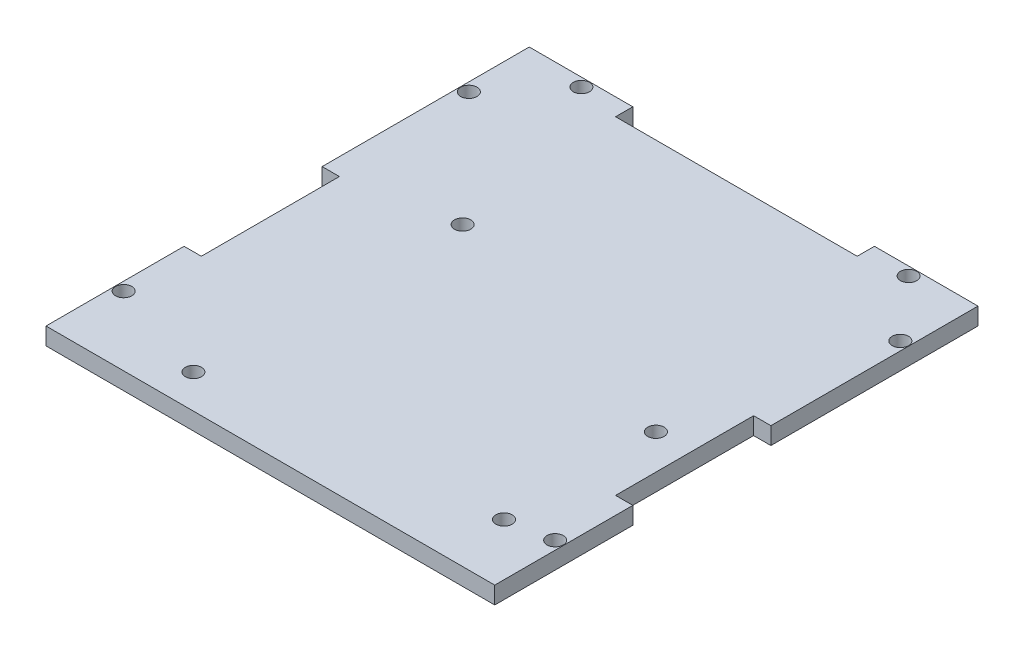
ISO-10303-21;
HEADER;
FILE_DESCRIPTION(('STEP AP214'),'2;1');
FILE_NAME('part.step','',(''),(''),'','','');
FILE_SCHEMA(('AUTOMOTIVE_DESIGN { 1 0 10303 214 1 1 1 1 }'));
ENDSEC;
DATA;
#1=APPLICATION_CONTEXT('core data for automotive mechanical design processes');
#2=APPLICATION_PROTOCOL_DEFINITION('international standard','automotive_design',2000,#1);
#3=PRODUCT_CONTEXT('',#1,'mechanical');
#4=PRODUCT('Part','Part','',(#3));
#5=PRODUCT_RELATED_PRODUCT_CATEGORY('part','',(#4));
#6=PRODUCT_DEFINITION_FORMATION('','',#4);
#7=PRODUCT_DEFINITION_CONTEXT('part definition',#1,'design');
#8=PRODUCT_DEFINITION('design','',#6,#7);
#9=PRODUCT_DEFINITION_SHAPE('','',#8);
#10=(LENGTH_UNIT() NAMED_UNIT(*) SI_UNIT(.MILLI.,.METRE.));
#11=(NAMED_UNIT(*) PLANE_ANGLE_UNIT() SI_UNIT($,.RADIAN.));
#12=(NAMED_UNIT(*) SI_UNIT($,.STERADIAN.) SOLID_ANGLE_UNIT());
#13=UNCERTAINTY_MEASURE_WITH_UNIT(LENGTH_MEASURE(1.E-05),#10,'distance_accuracy_value','');
#14=(GEOMETRIC_REPRESENTATION_CONTEXT(3) GLOBAL_UNCERTAINTY_ASSIGNED_CONTEXT((#13)) GLOBAL_UNIT_ASSIGNED_CONTEXT((#10,
#11,#12)) REPRESENTATION_CONTEXT('',''));
#15=CARTESIAN_POINT('',(0.,0.,0.));
#16=DIRECTION('',(0.,0.,1.));
#17=DIRECTION('',(1.,0.,0.));
#18=AXIS2_PLACEMENT_3D('',#15,#16,#17);
#19=CARTESIAN_POINT('',(41.275,3.175,-88.9000000000003));
#20=DIRECTION('',(0.,0.,1.));
#21=DIRECTION('',(1.,0.,0.));
#22=AXIS2_PLACEMENT_3D('',#19,#20,#21);
#23=PLANE('',#22);
#24=DIRECTION('',(-1.,0.,0.));
#25=VECTOR('',#24,1.);
#26=CARTESIAN_POINT('',(41.275,0.,-88.9000000000003));
#27=LINE('',#26,#25);
#28=CARTESIAN_POINT('',(41.275,0.,-88.9000000000003));
#29=VERTEX_POINT('',#28);
#30=CARTESIAN_POINT('',(22.225,0.,-88.9000000000002));
#31=VERTEX_POINT('',#30);
#32=EDGE_CURVE('E174',#29,#31,#27,.T.);
#33=ORIENTED_EDGE('',*,*,#32,.T.);
#34=DIRECTION('',(0.,-1.,0.));
#35=VECTOR('',#34,1.);
#36=CARTESIAN_POINT('',(22.225,3.175,-88.9000000000002));
#37=LINE('',#36,#35);
#38=CARTESIAN_POINT('',(22.225,3.175,-88.9000000000002));
#39=VERTEX_POINT('',#38);
#40=EDGE_CURVE('E11',#39,#31,#37,.T.);
#41=ORIENTED_EDGE('',*,*,#40,.F.);
#42=DIRECTION('',(-1.,0.,0.));
#43=VECTOR('',#42,1.);
#44=CARTESIAN_POINT('',(41.275,3.175,-88.9000000000003));
#45=LINE('',#44,#43);
#46=CARTESIAN_POINT('',(41.275,3.175,-88.9000000000003));
#47=VERTEX_POINT('',#46);
#48=EDGE_CURVE('E205',#47,#39,#45,.T.);
#49=ORIENTED_EDGE('',*,*,#48,.F.);
#50=DIRECTION('',(0.,-1.,0.));
#51=VECTOR('',#50,1.);
#52=CARTESIAN_POINT('',(41.275,3.175,-88.9000000000003));
#53=LINE('',#52,#51);
#54=EDGE_CURVE('E170',#47,#29,#53,.T.);
#55=ORIENTED_EDGE('',*,*,#54,.T.);
#56=EDGE_LOOP('',(#33,#41,#49,#55));
#57=FACE_BOUND('',#56,.T.);
#58=ADVANCED_FACE('F33',(#57),#23,.F.);
#59=CARTESIAN_POINT('',(22.225,3.175,-88.9000000000002));
#60=DIRECTION('',(1.,0.,0.));
#61=DIRECTION('',(0.,0.,-1.));
#62=AXIS2_PLACEMENT_3D('',#59,#60,#61);
#63=PLANE('',#62);
#64=DIRECTION('',(0.,0.,1.));
#65=VECTOR('',#64,1.);
#66=CARTESIAN_POINT('',(22.225,0.,-88.9000000000002));
#67=LINE('',#66,#65);
#68=CARTESIAN_POINT('',(22.225,0.,-85.7250000000002));
#69=VERTEX_POINT('',#68);
#70=EDGE_CURVE('E177',#31,#69,#67,.T.);
#71=ORIENTED_EDGE('',*,*,#70,.T.);
#72=DIRECTION('',(0.,-1.,0.));
#73=VECTOR('',#72,1.);
#74=CARTESIAN_POINT('',(22.225,3.175,-85.7250000000002));
#75=LINE('',#74,#73);
#76=CARTESIAN_POINT('',(22.225,3.175,-85.7250000000002));
#77=VERTEX_POINT('',#76);
#78=EDGE_CURVE('E41',#77,#69,#75,.T.);
#79=ORIENTED_EDGE('',*,*,#78,.F.);
#80=DIRECTION('',(0.,0.,1.));
#81=VECTOR('',#80,1.);
#82=CARTESIAN_POINT('',(22.225,3.175,-88.9000000000002));
#83=LINE('',#82,#81);
#84=EDGE_CURVE('E114',#39,#77,#83,.T.);
#85=ORIENTED_EDGE('',*,*,#84,.F.);
#86=ORIENTED_EDGE('',*,*,#40,.T.);
#87=EDGE_LOOP('',(#71,#79,#85,#86));
#88=FACE_BOUND('',#87,.T.);
#89=ADVANCED_FACE('F243',(#88),#63,.F.);
#90=CARTESIAN_POINT('',(-22.225,3.175,-85.7250000000002));
#91=DIRECTION('',(0.,0.,1.));
#92=DIRECTION('',(1.,0.,0.));
#93=AXIS2_PLACEMENT_3D('',#90,#91,#92);
#94=PLANE('',#93);
#95=DIRECTION('',(-1.,0.,0.));
#96=VECTOR('',#95,1.);
#97=CARTESIAN_POINT('',(-22.225,0.,-85.7250000000002));
#98=LINE('',#97,#96);
#99=CARTESIAN_POINT('',(-22.225,0.,-85.7250000000002));
#100=VERTEX_POINT('',#99);
#101=EDGE_CURVE('E181',#69,#100,#98,.T.);
#102=ORIENTED_EDGE('',*,*,#101,.T.);
#103=DIRECTION('',(0.,-1.,0.));
#104=VECTOR('',#103,1.);
#105=CARTESIAN_POINT('',(-22.225,3.175,-85.7250000000002));
#106=LINE('',#105,#104);
#107=CARTESIAN_POINT('',(-22.225,3.175,-85.7250000000002));
#108=VERTEX_POINT('',#107);
#109=EDGE_CURVE('E235',#108,#100,#106,.T.);
#110=ORIENTED_EDGE('',*,*,#109,.F.);
#111=DIRECTION('',(-1.,0.,0.));
#112=VECTOR('',#111,1.);
#113=CARTESIAN_POINT('',(10.2050575439094,3.175,-85.7250000000002));
#114=LINE('',#113,#112);
#115=EDGE_CURVE('E242',#77,#108,#114,.T.);
#116=ORIENTED_EDGE('',*,*,#115,.F.);
#117=ORIENTED_EDGE('',*,*,#78,.T.);
#118=EDGE_LOOP('',(#102,#110,#116,#117));
#119=FACE_BOUND('',#118,.T.);
#120=ADVANCED_FACE('F240',(#119),#94,.F.);
#121=CARTESIAN_POINT('',(-22.225,3.175,-88.9000000000002));
#122=DIRECTION('',(-1.,0.,0.));
#123=DIRECTION('',(0.,0.,1.));
#124=AXIS2_PLACEMENT_3D('',#121,#122,#123);
#125=PLANE('',#124);
#126=DIRECTION('',(0.,0.,-1.));
#127=VECTOR('',#126,1.);
#128=CARTESIAN_POINT('',(-22.225,0.,-88.9000000000002));
#129=LINE('',#128,#127);
#130=CARTESIAN_POINT('',(-22.225,0.,-88.9000000000002));
#131=VERTEX_POINT('',#130);
#132=EDGE_CURVE('E183',#100,#131,#129,.T.);
#133=ORIENTED_EDGE('',*,*,#132,.T.);
#134=DIRECTION('',(0.,-1.,0.));
#135=VECTOR('',#134,1.);
#136=CARTESIAN_POINT('',(-22.225,3.175,-88.9000000000002));
#137=LINE('',#136,#135);
#138=CARTESIAN_POINT('',(-22.225,3.175,-88.9000000000002));
#139=VERTEX_POINT('',#138);
#140=EDGE_CURVE('E232',#139,#131,#137,.T.);
#141=ORIENTED_EDGE('',*,*,#140,.F.);
#142=DIRECTION('',(0.,0.,-1.));
#143=VECTOR('',#142,1.);
#144=CARTESIAN_POINT('',(-22.225,3.175,-88.9000000000002));
#145=LINE('',#144,#143);
#146=EDGE_CURVE('E263',#108,#139,#145,.T.);
#147=ORIENTED_EDGE('',*,*,#146,.F.);
#148=ORIENTED_EDGE('',*,*,#109,.T.);
#149=EDGE_LOOP('',(#133,#141,#147,#148));
#150=FACE_BOUND('',#149,.T.);
#151=ADVANCED_FACE('F254',(#150),#125,.F.);
#152=CARTESIAN_POINT('',(-41.275,3.175,-88.9000000000003));
#153=DIRECTION('',(0.,0.,1.));
#154=DIRECTION('',(1.,0.,0.));
#155=AXIS2_PLACEMENT_3D('',#152,#153,#154);
#156=PLANE('',#155);
#157=DIRECTION('',(-1.,0.,0.));
#158=VECTOR('',#157,1.);
#159=CARTESIAN_POINT('',(-41.275,0.,-88.9000000000003));
#160=LINE('',#159,#158);
#161=CARTESIAN_POINT('',(-41.275,0.,-88.9000000000003));
#162=VERTEX_POINT('',#161);
#163=EDGE_CURVE('E185',#131,#162,#160,.T.);
#164=ORIENTED_EDGE('',*,*,#163,.T.);
#165=DIRECTION('',(0.,-1.,0.));
#166=VECTOR('',#165,1.);
#167=CARTESIAN_POINT('',(-41.275,3.175,-88.9000000000003));
#168=LINE('',#167,#166);
#169=CARTESIAN_POINT('',(-41.275,3.175,-88.9000000000003));
#170=VERTEX_POINT('',#169);
#171=EDGE_CURVE('E229',#170,#162,#168,.T.);
#172=ORIENTED_EDGE('',*,*,#171,.F.);
#173=DIRECTION('',(-1.,0.,0.));
#174=VECTOR('',#173,1.);
#175=CARTESIAN_POINT('',(-41.275,3.175,-88.9000000000003));
#176=LINE('',#175,#174);
#177=EDGE_CURVE('E260',#139,#170,#176,.T.);
#178=ORIENTED_EDGE('',*,*,#177,.F.);
#179=ORIENTED_EDGE('',*,*,#140,.T.);
#180=EDGE_LOOP('',(#164,#172,#178,#179));
#181=FACE_BOUND('',#180,.T.);
#182=ADVANCED_FACE('F258',(#181),#156,.F.);
#183=CARTESIAN_POINT('',(-41.275,3.175,-50.8000000000002));
#184=DIRECTION('',(1.,0.,0.));
#185=DIRECTION('',(0.,0.,-1.));
#186=AXIS2_PLACEMENT_3D('',#183,#184,#185);
#187=PLANE('',#186);
#188=DIRECTION('',(0.,0.,1.));
#189=VECTOR('',#188,1.);
#190=CARTESIAN_POINT('',(-41.275,0.,-50.8000000000002));
#191=LINE('',#190,#189);
#192=CARTESIAN_POINT('',(-41.275,0.,-50.8000000000002));
#193=VERTEX_POINT('',#192);
#194=EDGE_CURVE('E187',#162,#193,#191,.T.);
#195=ORIENTED_EDGE('',*,*,#194,.T.);
#196=DIRECTION('',(0.,-1.,0.));
#197=VECTOR('',#196,1.);
#198=CARTESIAN_POINT('',(-41.275,3.175,-50.8000000000002));
#199=LINE('',#198,#197);
#200=CARTESIAN_POINT('',(-41.275,3.175,-50.8000000000002));
#201=VERTEX_POINT('',#200);
#202=EDGE_CURVE('E226',#201,#193,#199,.T.);
#203=ORIENTED_EDGE('',*,*,#202,.F.);
#204=DIRECTION('',(0.,0.,1.));
#205=VECTOR('',#204,1.);
#206=CARTESIAN_POINT('',(-41.275,3.175,-50.8000000000002));
#207=LINE('',#206,#205);
#208=EDGE_CURVE('E262',#170,#201,#207,.T.);
#209=ORIENTED_EDGE('',*,*,#208,.F.);
#210=ORIENTED_EDGE('',*,*,#171,.T.);
#211=EDGE_LOOP('',(#195,#203,#209,#210));
#212=FACE_BOUND('',#211,.T.);
#213=ADVANCED_FACE('F320',(#212),#187,.F.);
#214=CARTESIAN_POINT('',(-41.275,3.175,-50.8000000000002));
#215=DIRECTION('',(0.,0.,-1.));
#216=DIRECTION('',(-1.,0.,0.));
#217=AXIS2_PLACEMENT_3D('',#214,#215,#216);
#218=PLANE('',#217);
#219=DIRECTION('',(1.,0.,0.));
#220=VECTOR('',#219,1.);
#221=CARTESIAN_POINT('',(-41.275,0.,-50.8000000000002));
#222=LINE('',#221,#220);
#223=CARTESIAN_POINT('',(-38.1,0.,-50.8000000000002));
#224=VERTEX_POINT('',#223);
#225=EDGE_CURVE('E189',#193,#224,#222,.T.);
#226=ORIENTED_EDGE('',*,*,#225,.T.);
#227=DIRECTION('',(0.,-1.,0.));
#228=VECTOR('',#227,1.);
#229=CARTESIAN_POINT('',(-38.1,3.175,-50.8000000000002));
#230=LINE('',#229,#228);
#231=CARTESIAN_POINT('',(-38.1,3.175,-50.8000000000002));
#232=VERTEX_POINT('',#231);
#233=EDGE_CURVE('E223',#232,#224,#230,.T.);
#234=ORIENTED_EDGE('',*,*,#233,.F.);
#235=DIRECTION('',(1.,0.,0.));
#236=VECTOR('',#235,1.);
#237=CARTESIAN_POINT('',(-41.275,3.175,-50.8000000000002));
#238=LINE('',#237,#236);
#239=EDGE_CURVE('E265',#201,#232,#238,.T.);
#240=ORIENTED_EDGE('',*,*,#239,.F.);
#241=ORIENTED_EDGE('',*,*,#202,.T.);
#242=EDGE_LOOP('',(#226,#234,#240,#241));
#243=FACE_BOUND('',#242,.T.);
#244=ADVANCED_FACE('F317',(#243),#218,.F.);
#245=CARTESIAN_POINT('',(-38.1,3.175,-50.8000000000002));
#246=DIRECTION('',(1.,0.,0.));
#247=DIRECTION('',(0.,0.,-1.));
#248=AXIS2_PLACEMENT_3D('',#245,#246,#247);
#249=PLANE('',#248);
#250=DIRECTION('',(0.,0.,1.));
#251=VECTOR('',#250,1.);
#252=CARTESIAN_POINT('',(-38.1,0.,-50.8000000000002));
#253=LINE('',#252,#251);
#254=CARTESIAN_POINT('',(-38.1,0.,-25.4000000000002));
#255=VERTEX_POINT('',#254);
#256=EDGE_CURVE('E191',#224,#255,#253,.T.);
#257=ORIENTED_EDGE('',*,*,#256,.T.);
#258=DIRECTION('',(0.,-1.,0.));
#259=VECTOR('',#258,1.);
#260=CARTESIAN_POINT('',(-38.1,3.175,-25.4000000000002));
#261=LINE('',#260,#259);
#262=CARTESIAN_POINT('',(-38.1,3.175,-25.4000000000002));
#263=VERTEX_POINT('',#262);
#264=EDGE_CURVE('E220',#263,#255,#261,.T.);
#265=ORIENTED_EDGE('',*,*,#264,.F.);
#266=DIRECTION('',(0.,0.,1.));
#267=VECTOR('',#266,1.);
#268=CARTESIAN_POINT('',(-38.1,3.175,-50.8000000000002));
#269=LINE('',#268,#267);
#270=EDGE_CURVE('E271',#232,#263,#269,.T.);
#271=ORIENTED_EDGE('',*,*,#270,.F.);
#272=ORIENTED_EDGE('',*,*,#233,.T.);
#273=EDGE_LOOP('',(#257,#265,#271,#272));
#274=FACE_BOUND('',#273,.T.);
#275=ADVANCED_FACE('F313',(#274),#249,.F.);
#276=CARTESIAN_POINT('',(-38.1,3.175,-25.4000000000002));
#277=DIRECTION('',(0.,0.,1.));
#278=DIRECTION('',(1.,0.,0.));
#279=AXIS2_PLACEMENT_3D('',#276,#277,#278);
#280=PLANE('',#279);
#281=DIRECTION('',(-1.,0.,0.));
#282=VECTOR('',#281,1.);
#283=CARTESIAN_POINT('',(-38.1,0.,-25.4000000000002));
#284=LINE('',#283,#282);
#285=CARTESIAN_POINT('',(-41.275,0.,-25.4000000000002));
#286=VERTEX_POINT('',#285);
#287=EDGE_CURVE('E193',#255,#286,#284,.T.);
#288=ORIENTED_EDGE('',*,*,#287,.T.);
#289=DIRECTION('',(0.,-1.,0.));
#290=VECTOR('',#289,1.);
#291=CARTESIAN_POINT('',(-41.275,3.175,-25.4000000000002));
#292=LINE('',#291,#290);
#293=CARTESIAN_POINT('',(-41.275,3.175,-25.4000000000002));
#294=VERTEX_POINT('',#293);
#295=EDGE_CURVE('E217',#294,#286,#292,.T.);
#296=ORIENTED_EDGE('',*,*,#295,.F.);
#297=DIRECTION('',(-1.,0.,0.));
#298=VECTOR('',#297,1.);
#299=CARTESIAN_POINT('',(-38.1,3.175,-25.4000000000002));
#300=LINE('',#299,#298);
#301=EDGE_CURVE('E273',#263,#294,#300,.T.);
#302=ORIENTED_EDGE('',*,*,#301,.F.);
#303=ORIENTED_EDGE('',*,*,#264,.T.);
#304=EDGE_LOOP('',(#288,#296,#302,#303));
#305=FACE_BOUND('',#304,.T.);
#306=ADVANCED_FACE('F309',(#305),#280,.F.);
#307=CARTESIAN_POINT('',(-41.275,3.175,0.));
#308=DIRECTION('',(1.,0.,0.));
#309=DIRECTION('',(0.,0.,-1.));
#310=AXIS2_PLACEMENT_3D('',#307,#308,#309);
#311=PLANE('',#310);
#312=DIRECTION('',(0.,0.,1.));
#313=VECTOR('',#312,1.);
#314=CARTESIAN_POINT('',(-41.275,0.,0.));
#315=LINE('',#314,#313);
#316=CARTESIAN_POINT('',(-41.275,0.,0.));
#317=VERTEX_POINT('',#316);
#318=EDGE_CURVE('E195',#286,#317,#315,.T.);
#319=ORIENTED_EDGE('',*,*,#318,.T.);
#320=DIRECTION('',(0.,-1.,0.));
#321=VECTOR('',#320,1.);
#322=CARTESIAN_POINT('',(-41.275,3.175,0.));
#323=LINE('',#322,#321);
#324=CARTESIAN_POINT('',(-41.275,3.175,0.));
#325=VERTEX_POINT('',#324);
#326=EDGE_CURVE('E215',#325,#317,#323,.T.);
#327=ORIENTED_EDGE('',*,*,#326,.F.);
#328=DIRECTION('',(0.,0.,1.));
#329=VECTOR('',#328,1.);
#330=CARTESIAN_POINT('',(-41.275,3.175,0.));
#331=LINE('',#330,#329);
#332=EDGE_CURVE('E275',#294,#325,#331,.T.);
#333=ORIENTED_EDGE('',*,*,#332,.F.);
#334=ORIENTED_EDGE('',*,*,#295,.T.);
#335=EDGE_LOOP('',(#319,#327,#333,#334));
#336=FACE_BOUND('',#335,.T.);
#337=ADVANCED_FACE('F304',(#336),#311,.F.);
#338=CARTESIAN_POINT('',(41.275,3.175,0.));
#339=DIRECTION('',(-1.,0.,0.));
#340=DIRECTION('',(0.,0.,1.));
#341=AXIS2_PLACEMENT_3D('',#338,#339,#340);
#342=PLANE('',#341);
#343=DIRECTION('',(0.,0.,-1.));
#344=VECTOR('',#343,1.);
#345=CARTESIAN_POINT('',(41.275,0.,0.));
#346=LINE('',#345,#344);
#347=CARTESIAN_POINT('',(41.275,0.,0.));
#348=VERTEX_POINT('',#347);
#349=CARTESIAN_POINT('',(41.275,0.,-25.4000000000002));
#350=VERTEX_POINT('',#349);
#351=EDGE_CURVE('E198',#348,#350,#346,.T.);
#352=ORIENTED_EDGE('',*,*,#351,.T.);
#353=DIRECTION('',(0.,-1.,0.));
#354=VECTOR('',#353,1.);
#355=CARTESIAN_POINT('',(41.275,3.175,-25.4000000000002));
#356=LINE('',#355,#354);
#357=CARTESIAN_POINT('',(41.275,3.175,-25.4000000000002));
#358=VERTEX_POINT('',#357);
#359=EDGE_CURVE('E209',#358,#350,#356,.T.);
#360=ORIENTED_EDGE('',*,*,#359,.F.);
#361=DIRECTION('',(0.,0.,-1.));
#362=VECTOR('',#361,1.);
#363=CARTESIAN_POINT('',(41.275,3.175,0.));
#364=LINE('',#363,#362);
#365=CARTESIAN_POINT('',(41.275,3.175,0.));
#366=VERTEX_POINT('',#365);
#367=EDGE_CURVE('E278',#366,#358,#364,.T.);
#368=ORIENTED_EDGE('',*,*,#367,.F.);
#369=DIRECTION('',(0.,-1.,0.));
#370=VECTOR('',#369,1.);
#371=CARTESIAN_POINT('',(41.275,3.175,0.));
#372=LINE('',#371,#370);
#373=EDGE_CURVE('E212',#366,#348,#372,.T.);
#374=ORIENTED_EDGE('',*,*,#373,.T.);
#375=EDGE_LOOP('',(#352,#360,#368,#374));
#376=FACE_BOUND('',#375,.T.);
#377=ADVANCED_FACE('F285',(#376),#342,.F.);
#378=CARTESIAN_POINT('',(38.1,3.175,-25.4000000000002));
#379=DIRECTION('',(0.,0.,1.));
#380=DIRECTION('',(1.,0.,0.));
#381=AXIS2_PLACEMENT_3D('',#378,#379,#380);
#382=PLANE('',#381);
#383=DIRECTION('',(-1.,0.,0.));
#384=VECTOR('',#383,1.);
#385=CARTESIAN_POINT('',(38.1,0.,-25.4000000000002));
#386=LINE('',#385,#384);
#387=CARTESIAN_POINT('',(38.1,0.,-25.4000000000002));
#388=VERTEX_POINT('',#387);
#389=EDGE_CURVE('E200',#350,#388,#386,.T.);
#390=ORIENTED_EDGE('',*,*,#389,.T.);
#391=DIRECTION('',(0.,-1.,0.));
#392=VECTOR('',#391,1.);
#393=CARTESIAN_POINT('',(38.1,3.175,-25.4000000000002));
#394=LINE('',#393,#392);
#395=CARTESIAN_POINT('',(38.1,3.175,-25.4000000000002));
#396=VERTEX_POINT('',#395);
#397=EDGE_CURVE('E165',#396,#388,#394,.T.);
#398=ORIENTED_EDGE('',*,*,#397,.F.);
#399=DIRECTION('',(-1.,0.,0.));
#400=VECTOR('',#399,1.);
#401=CARTESIAN_POINT('',(38.1,3.175,-25.4000000000002));
#402=LINE('',#401,#400);
#403=EDGE_CURVE('E156',#358,#396,#402,.T.);
#404=ORIENTED_EDGE('',*,*,#403,.F.);
#405=ORIENTED_EDGE('',*,*,#359,.T.);
#406=EDGE_LOOP('',(#390,#398,#404,#405));
#407=FACE_BOUND('',#406,.T.);
#408=ADVANCED_FACE('F288',(#407),#382,.F.);
#409=CARTESIAN_POINT('',(38.1,3.175,-50.8000000000002));
#410=DIRECTION('',(-1.,0.,0.));
#411=DIRECTION('',(0.,0.,1.));
#412=AXIS2_PLACEMENT_3D('',#409,#410,#411);
#413=PLANE('',#412);
#414=DIRECTION('',(0.,0.,-1.));
#415=VECTOR('',#414,1.);
#416=CARTESIAN_POINT('',(38.1,0.,-50.8000000000002));
#417=LINE('',#416,#415);
#418=CARTESIAN_POINT('',(38.1,0.,-50.8000000000002));
#419=VERTEX_POINT('',#418);
#420=EDGE_CURVE('E164',#388,#419,#417,.T.);
#421=ORIENTED_EDGE('',*,*,#420,.T.);
#422=DIRECTION('',(0.,-1.,0.));
#423=VECTOR('',#422,1.);
#424=CARTESIAN_POINT('',(38.1,3.175,-50.8000000000002));
#425=LINE('',#424,#423);
#426=CARTESIAN_POINT('',(38.1,3.175,-50.8000000000002));
#427=VERTEX_POINT('',#426);
#428=EDGE_CURVE('E161',#427,#419,#425,.T.);
#429=ORIENTED_EDGE('',*,*,#428,.F.);
#430=DIRECTION('',(0.,0.,-1.));
#431=VECTOR('',#430,1.);
#432=CARTESIAN_POINT('',(38.1,3.175,-50.8000000000002));
#433=LINE('',#432,#431);
#434=EDGE_CURVE('E148',#396,#427,#433,.T.);
#435=ORIENTED_EDGE('',*,*,#434,.F.);
#436=ORIENTED_EDGE('',*,*,#397,.T.);
#437=EDGE_LOOP('',(#421,#429,#435,#436));
#438=FACE_BOUND('',#437,.T.);
#439=ADVANCED_FACE('F162',(#438),#413,.F.);
#440=CARTESIAN_POINT('',(41.275,3.175,-50.8000000000002));
#441=DIRECTION('',(0.,0.,-1.));
#442=DIRECTION('',(-1.,0.,0.));
#443=AXIS2_PLACEMENT_3D('',#440,#441,#442);
#444=PLANE('',#443);
#445=DIRECTION('',(1.,0.,0.));
#446=VECTOR('',#445,1.);
#447=CARTESIAN_POINT('',(41.275,0.,-50.8000000000002));
#448=LINE('',#447,#446);
#449=CARTESIAN_POINT('',(41.275,0.,-50.8000000000002));
#450=VERTEX_POINT('',#449);
#451=EDGE_CURVE('E100',#419,#450,#448,.T.);
#452=ORIENTED_EDGE('',*,*,#451,.T.);
#453=DIRECTION('',(0.,-1.,0.));
#454=VECTOR('',#453,1.);
#455=CARTESIAN_POINT('',(41.275,3.175,-50.8000000000002));
#456=LINE('',#455,#454);
#457=CARTESIAN_POINT('',(41.275,3.175,-50.8000000000002));
#458=VERTEX_POINT('',#457);
#459=EDGE_CURVE('E166',#458,#450,#456,.T.);
#460=ORIENTED_EDGE('',*,*,#459,.F.);
#461=DIRECTION('',(1.,0.,0.));
#462=VECTOR('',#461,1.);
#463=CARTESIAN_POINT('',(41.275,3.175,-50.8000000000002));
#464=LINE('',#463,#462);
#465=EDGE_CURVE('E154',#427,#458,#464,.T.);
#466=ORIENTED_EDGE('',*,*,#465,.F.);
#467=ORIENTED_EDGE('',*,*,#428,.T.);
#468=EDGE_LOOP('',(#452,#460,#466,#467));
#469=FACE_BOUND('',#468,.T.);
#470=ADVANCED_FACE('F168',(#469),#444,.F.);
#471=CARTESIAN_POINT('',(41.275,3.175,-50.8000000000002));
#472=DIRECTION('',(-1.,0.,0.));
#473=DIRECTION('',(0.,0.,1.));
#474=AXIS2_PLACEMENT_3D('',#471,#472,#473);
#475=PLANE('',#474);
#476=DIRECTION('',(0.,0.,-1.));
#477=VECTOR('',#476,1.);
#478=CARTESIAN_POINT('',(41.275,0.,-50.8000000000002));
#479=LINE('',#478,#477);
#480=EDGE_CURVE('E106',#450,#29,#479,.T.);
#481=ORIENTED_EDGE('',*,*,#480,.T.);
#482=ORIENTED_EDGE('',*,*,#54,.F.);
#483=DIRECTION('',(0.,0.,-1.));
#484=VECTOR('',#483,1.);
#485=CARTESIAN_POINT('',(41.275,3.175,-50.8000000000002));
#486=LINE('',#485,#484);
#487=EDGE_CURVE('E49',#458,#47,#486,.T.);
#488=ORIENTED_EDGE('',*,*,#487,.F.);
#489=ORIENTED_EDGE('',*,*,#459,.T.);
#490=EDGE_LOOP('',(#481,#482,#488,#489));
#491=FACE_BOUND('',#490,.T.);
#492=ADVANCED_FACE('F335',(#491),#475,.F.);
#493=CARTESIAN_POINT('',(0.,3.175,0.));
#494=DIRECTION('',(0.,1.,0.));
#495=DIRECTION('',(0.,0.,1.));
#496=AXIS2_PLACEMENT_3D('',#493,#494,#495);
#497=PLANE('',#496);
#498=CARTESIAN_POINT('',(30.099,3.175,-87.3125000000002));
#499=DIRECTION('',(0.,1.,0.));
#500=DIRECTION('',(0.,0.,1.));
#501=AXIS2_PLACEMENT_3D('',#498,#499,#500);
#502=CIRCLE('',#501,1.5);
#503=CARTESIAN_POINT('',(30.099,3.175,-85.8125000000002));
#504=VERTEX_POINT('',#503);
#505=EDGE_CURVE('E513',#504,#504,#502,.T.);
#506=ORIENTED_EDGE('',*,*,#505,.F.);
#507=EDGE_LOOP('',(#506));
#508=FACE_BOUND('',#507,.T.);
#509=CARTESIAN_POINT('',(-30.099,3.175,-87.3125000000002));
#510=DIRECTION('',(0.,1.,0.));
#511=DIRECTION('',(0.,0.,1.));
#512=AXIS2_PLACEMENT_3D('',#509,#510,#511);
#513=CIRCLE('',#512,1.5);
#514=CARTESIAN_POINT('',(-30.099,3.175,-85.8125000000002));
#515=VERTEX_POINT('',#514);
#516=EDGE_CURVE('E515',#515,#515,#513,.T.);
#517=ORIENTED_EDGE('',*,*,#516,.F.);
#518=EDGE_LOOP('',(#517));
#519=FACE_BOUND('',#518,.T.);
#520=DIRECTION('',(-1.,0.,0.));
#521=VECTOR('',#520,1.);
#522=CARTESIAN_POINT('',(41.275,3.175,0.));
#523=LINE('',#522,#521);
#524=EDGE_CURVE('E283',#366,#325,#523,.T.);
#525=ORIENTED_EDGE('',*,*,#524,.F.);
#526=ORIENTED_EDGE('',*,*,#367,.T.);
#527=ORIENTED_EDGE('',*,*,#403,.T.);
#528=ORIENTED_EDGE('',*,*,#434,.T.);
#529=ORIENTED_EDGE('',*,*,#465,.T.);
#530=ORIENTED_EDGE('',*,*,#487,.T.);
#531=ORIENTED_EDGE('',*,*,#48,.T.);
#532=ORIENTED_EDGE('',*,*,#84,.T.);
#533=ORIENTED_EDGE('',*,*,#115,.T.);
#534=ORIENTED_EDGE('',*,*,#146,.T.);
#535=ORIENTED_EDGE('',*,*,#177,.T.);
#536=ORIENTED_EDGE('',*,*,#208,.T.);
#537=ORIENTED_EDGE('',*,*,#239,.T.);
#538=ORIENTED_EDGE('',*,*,#270,.T.);
#539=ORIENTED_EDGE('',*,*,#301,.T.);
#540=ORIENTED_EDGE('',*,*,#332,.T.);
#541=EDGE_LOOP('',(#525,#526,#527,#528,#529,#530,#531,#532,#533,#534,#535,#536,#537,#538,#539,#540));
#542=FACE_BOUND('',#541,.T.);
#543=CARTESIAN_POINT('',(-19.1185113449206,3.175,-54.4850000000003));
#544=DIRECTION('',(0.,1.,0.));
#545=DIRECTION('',(0.,0.,1.));
#546=AXIS2_PLACEMENT_3D('',#543,#544,#545);
#547=CIRCLE('',#546,1.5);
#548=CARTESIAN_POINT('',(-19.1185113449206,3.175,-52.9850000000003));
#549=VERTEX_POINT('',#548);
#550=EDGE_CURVE('E522',#549,#549,#547,.T.);
#551=ORIENTED_EDGE('',*,*,#550,.F.);
#552=EDGE_LOOP('',(#551));
#553=FACE_BOUND('',#552,.T.);
#554=CARTESIAN_POINT('',(-20.3885113449206,3.175,-6.22500000000029));
#555=DIRECTION('',(0.,1.,0.));
#556=DIRECTION('',(0.,0.,1.));
#557=AXIS2_PLACEMENT_3D('',#554,#555,#556);
#558=CIRCLE('',#557,1.5);
#559=CARTESIAN_POINT('',(-20.3885113449206,3.175,-4.72500000000029));
#560=VERTEX_POINT('',#559);
#561=EDGE_CURVE('E527',#560,#560,#558,.T.);
#562=ORIENTED_EDGE('',*,*,#561,.F.);
#563=EDGE_LOOP('',(#562));
#564=FACE_BOUND('',#563,.T.);
#565=CARTESIAN_POINT('',(31.6814886550794,3.175,-39.2450000000003));
#566=DIRECTION('',(0.,1.,0.));
#567=DIRECTION('',(0.,0.,1.));
#568=AXIS2_PLACEMENT_3D('',#565,#566,#567);
#569=CIRCLE('',#568,1.5);
#570=CARTESIAN_POINT('',(31.6814886550794,3.175,-37.7450000000003));
#571=VERTEX_POINT('',#570);
#572=EDGE_CURVE('E533',#571,#571,#569,.T.);
#573=ORIENTED_EDGE('',*,*,#572,.F.);
#574=EDGE_LOOP('',(#573));
#575=FACE_BOUND('',#574,.T.);
#576=CARTESIAN_POINT('',(31.6814886550794,3.175,-11.3050000000003));
#577=DIRECTION('',(0.,1.,0.));
#578=DIRECTION('',(0.,0.,1.));
#579=AXIS2_PLACEMENT_3D('',#576,#577,#578);
#580=CIRCLE('',#579,1.5);
#581=CARTESIAN_POINT('',(31.6814886550794,3.175,-9.80500000000028));
#582=VERTEX_POINT('',#581);
#583=EDGE_CURVE('E539',#582,#582,#580,.T.);
#584=ORIENTED_EDGE('',*,*,#583,.F.);
#585=EDGE_LOOP('',(#584));
#586=FACE_BOUND('',#585,.T.);
#587=CARTESIAN_POINT('',(39.6875,3.175,-76.2000000000003));
#588=DIRECTION('',(0.,-1.,0.));
#589=DIRECTION('',(0.,0.,1.));
#590=AXIS2_PLACEMENT_3D('',#587,#588,#589);
#591=CIRCLE('',#590,1.5);
#592=CARTESIAN_POINT('',(39.6875,3.175,-74.7000000000003));
#593=VERTEX_POINT('',#592);
#594=EDGE_CURVE('E548',#593,#593,#591,.T.);
#595=ORIENTED_EDGE('',*,*,#594,.T.);
#596=EDGE_LOOP('',(#595));
#597=FACE_BOUND('',#596,.T.);
#598=CARTESIAN_POINT('',(39.6875,3.175,-12.7000000000002));
#599=DIRECTION('',(0.,-1.,0.));
#600=DIRECTION('',(0.,0.,1.));
#601=AXIS2_PLACEMENT_3D('',#598,#599,#600);
#602=CIRCLE('',#601,1.500000048);
#603=CARTESIAN_POINT('',(39.6875,3.175,-11.1999999520002));
#604=VERTEX_POINT('',#603);
#605=EDGE_CURVE('E554',#604,#604,#602,.T.);
#606=ORIENTED_EDGE('',*,*,#605,.T.);
#607=EDGE_LOOP('',(#606));
#608=FACE_BOUND('',#607,.T.);
#609=CARTESIAN_POINT('',(-39.6875,3.175,-12.7000000000002));
#610=DIRECTION('',(0.,-1.,0.));
#611=DIRECTION('',(0.,0.,-1.));
#612=AXIS2_PLACEMENT_3D('',#609,#610,#611);
#613=CIRCLE('',#612,1.500000048);
#614=CARTESIAN_POINT('',(-39.6875,3.175,-14.2000000480002));
#615=VERTEX_POINT('',#614);
#616=EDGE_CURVE('E560',#615,#615,#613,.T.);
#617=ORIENTED_EDGE('',*,*,#616,.T.);
#618=EDGE_LOOP('',(#617));
#619=FACE_BOUND('',#618,.T.);
#620=CARTESIAN_POINT('',(-39.6875,3.175,-76.2000000000003));
#621=DIRECTION('',(0.,-1.,0.));
#622=DIRECTION('',(0.,0.,-1.));
#623=AXIS2_PLACEMENT_3D('',#620,#621,#622);
#624=CIRCLE('',#623,1.5);
#625=CARTESIAN_POINT('',(-39.6875,3.175,-77.7000000000003));
#626=VERTEX_POINT('',#625);
#627=EDGE_CURVE('E178',#626,#626,#624,.T.);
#628=ORIENTED_EDGE('',*,*,#627,.T.);
#629=EDGE_LOOP('',(#628));
#630=FACE_BOUND('',#629,.T.);
#631=ADVANCED_FACE('F151',(#508,#519,#542,#553,#564,#575,#586,#597,#608,#619,#630),#497,.T.);
#632=CARTESIAN_POINT('',(0.,0.,0.));
#633=DIRECTION('',(0.,1.,0.));
#634=DIRECTION('',(0.,0.,1.));
#635=AXIS2_PLACEMENT_3D('',#632,#633,#634);
#636=PLANE('',#635);
#637=CARTESIAN_POINT('',(30.099,0.,-87.3125000000002));
#638=DIRECTION('',(0.,1.,0.));
#639=DIRECTION('',(0.,0.,1.));
#640=AXIS2_PLACEMENT_3D('',#637,#638,#639);
#641=CIRCLE('',#640,1.5);
#642=CARTESIAN_POINT('',(30.099,0.,-85.8125000000002));
#643=VERTEX_POINT('',#642);
#644=EDGE_CURVE('E510',#643,#643,#641,.T.);
#645=ORIENTED_EDGE('',*,*,#644,.T.);
#646=EDGE_LOOP('',(#645));
#647=FACE_BOUND('',#646,.T.);
#648=CARTESIAN_POINT('',(-30.099,0.,-87.3125000000002));
#649=DIRECTION('',(0.,1.,0.));
#650=DIRECTION('',(0.,0.,1.));
#651=AXIS2_PLACEMENT_3D('',#648,#649,#650);
#652=CIRCLE('',#651,1.5);
#653=CARTESIAN_POINT('',(-30.099,0.,-85.8125000000002));
#654=VERTEX_POINT('',#653);
#655=EDGE_CURVE('E298',#654,#654,#652,.T.);
#656=ORIENTED_EDGE('',*,*,#655,.T.);
#657=EDGE_LOOP('',(#656));
#658=FACE_BOUND('',#657,.T.);
#659=CARTESIAN_POINT('',(-19.1185113449206,0.,-54.4850000000003));
#660=DIRECTION('',(0.,1.,0.));
#661=DIRECTION('',(0.,0.,1.));
#662=AXIS2_PLACEMENT_3D('',#659,#660,#661);
#663=CIRCLE('',#662,1.5);
#664=CARTESIAN_POINT('',(-19.1185113449206,0.,-52.9850000000003));
#665=VERTEX_POINT('',#664);
#666=EDGE_CURVE('E524',#665,#665,#663,.T.);
#667=ORIENTED_EDGE('',*,*,#666,.T.);
#668=EDGE_LOOP('',(#667));
#669=FACE_BOUND('',#668,.T.);
#670=CARTESIAN_POINT('',(-20.3885113449206,0.,-6.22500000000029));
#671=DIRECTION('',(0.,1.,0.));
#672=DIRECTION('',(0.,0.,1.));
#673=AXIS2_PLACEMENT_3D('',#670,#671,#672);
#674=CIRCLE('',#673,1.5);
#675=CARTESIAN_POINT('',(-20.3885113449206,0.,-4.72500000000029));
#676=VERTEX_POINT('',#675);
#677=EDGE_CURVE('E530',#676,#676,#674,.T.);
#678=ORIENTED_EDGE('',*,*,#677,.T.);
#679=EDGE_LOOP('',(#678));
#680=FACE_BOUND('',#679,.T.);
#681=CARTESIAN_POINT('',(31.6814886550794,0.,-39.2450000000003));
#682=DIRECTION('',(0.,1.,0.));
#683=DIRECTION('',(0.,0.,1.));
#684=AXIS2_PLACEMENT_3D('',#681,#682,#683);
#685=CIRCLE('',#684,1.5);
#686=CARTESIAN_POINT('',(31.6814886550794,0.,-37.7450000000003));
#687=VERTEX_POINT('',#686);
#688=EDGE_CURVE('E536',#687,#687,#685,.T.);
#689=ORIENTED_EDGE('',*,*,#688,.T.);
#690=EDGE_LOOP('',(#689));
#691=FACE_BOUND('',#690,.T.);
#692=CARTESIAN_POINT('',(31.6814886550794,0.,-11.3050000000003));
#693=DIRECTION('',(0.,1.,0.));
#694=DIRECTION('',(0.,0.,1.));
#695=AXIS2_PLACEMENT_3D('',#692,#693,#694);
#696=CIRCLE('',#695,1.5);
#697=CARTESIAN_POINT('',(31.6814886550794,0.,-9.80500000000028));
#698=VERTEX_POINT('',#697);
#699=EDGE_CURVE('E542',#698,#698,#696,.T.);
#700=ORIENTED_EDGE('',*,*,#699,.T.);
#701=EDGE_LOOP('',(#700));
#702=FACE_BOUND('',#701,.T.);
#703=CARTESIAN_POINT('',(39.6875,0.,-76.2000000000003));
#704=DIRECTION('',(0.,-1.,0.));
#705=DIRECTION('',(0.,0.,1.));
#706=AXIS2_PLACEMENT_3D('',#703,#704,#705);
#707=CIRCLE('',#706,1.5);
#708=CARTESIAN_POINT('',(39.6875,0.,-74.7000000000003));
#709=VERTEX_POINT('',#708);
#710=EDGE_CURVE('E545',#709,#709,#707,.T.);
#711=ORIENTED_EDGE('',*,*,#710,.F.);
#712=EDGE_LOOP('',(#711));
#713=FACE_BOUND('',#712,.T.);
#714=CARTESIAN_POINT('',(39.6875,0.,-12.7000000000002));
#715=DIRECTION('',(0.,-1.,0.));
#716=DIRECTION('',(0.,0.,1.));
#717=AXIS2_PLACEMENT_3D('',#714,#715,#716);
#718=CIRCLE('',#717,1.500000048);
#719=CARTESIAN_POINT('',(39.6875,0.,-11.1999999520002));
#720=VERTEX_POINT('',#719);
#721=EDGE_CURVE('E551',#720,#720,#718,.T.);
#722=ORIENTED_EDGE('',*,*,#721,.F.);
#723=EDGE_LOOP('',(#722));
#724=FACE_BOUND('',#723,.T.);
#725=CARTESIAN_POINT('',(-39.6875,0.,-12.7000000000002));
#726=DIRECTION('',(0.,-1.,0.));
#727=DIRECTION('',(0.,0.,-1.));
#728=AXIS2_PLACEMENT_3D('',#725,#726,#727);
#729=CIRCLE('',#728,1.500000048);
#730=CARTESIAN_POINT('',(-39.6875,0.,-14.2000000480002));
#731=VERTEX_POINT('',#730);
#732=EDGE_CURVE('E557',#731,#731,#729,.T.);
#733=ORIENTED_EDGE('',*,*,#732,.F.);
#734=EDGE_LOOP('',(#733));
#735=FACE_BOUND('',#734,.T.);
#736=CARTESIAN_POINT('',(-39.6875,0.,-76.2000000000003));
#737=DIRECTION('',(0.,-1.,0.));
#738=DIRECTION('',(0.,0.,-1.));
#739=AXIS2_PLACEMENT_3D('',#736,#737,#738);
#740=CIRCLE('',#739,1.5);
#741=CARTESIAN_POINT('',(-39.6875,0.,-77.7000000000003));
#742=VERTEX_POINT('',#741);
#743=EDGE_CURVE('E563',#742,#742,#740,.T.);
#744=ORIENTED_EDGE('',*,*,#743,.F.);
#745=EDGE_LOOP('',(#744));
#746=FACE_BOUND('',#745,.T.);
#747=ORIENTED_EDGE('',*,*,#351,.F.);
#748=DIRECTION('',(-1.,0.,0.));
#749=VECTOR('',#748,1.);
#750=CARTESIAN_POINT('',(41.275,0.,0.));
#751=LINE('',#750,#749);
#752=EDGE_CURVE('E292',#348,#317,#751,.T.);
#753=ORIENTED_EDGE('',*,*,#752,.T.);
#754=ORIENTED_EDGE('',*,*,#318,.F.);
#755=ORIENTED_EDGE('',*,*,#287,.F.);
#756=ORIENTED_EDGE('',*,*,#256,.F.);
#757=ORIENTED_EDGE('',*,*,#225,.F.);
#758=ORIENTED_EDGE('',*,*,#194,.F.);
#759=ORIENTED_EDGE('',*,*,#163,.F.);
#760=ORIENTED_EDGE('',*,*,#132,.F.);
#761=ORIENTED_EDGE('',*,*,#101,.F.);
#762=ORIENTED_EDGE('',*,*,#70,.F.);
#763=ORIENTED_EDGE('',*,*,#32,.F.);
#764=ORIENTED_EDGE('',*,*,#480,.F.);
#765=ORIENTED_EDGE('',*,*,#451,.F.);
#766=ORIENTED_EDGE('',*,*,#420,.F.);
#767=ORIENTED_EDGE('',*,*,#389,.F.);
#768=EDGE_LOOP('',(#747,#753,#754,#755,#756,#757,#758,#759,#760,#761,#762,#763,#764,#765,#766,#767));
#769=FACE_BOUND('',#768,.T.);
#770=ADVANCED_FACE('F248',(#647,#658,#669,#680,#691,#702,#713,#724,#735,#746,#769),#636,.F.);
#771=CARTESIAN_POINT('',(-39.6875,3.175,-76.2000000000003));
#772=DIRECTION('',(0.,-1.,0.));
#773=DIRECTION('',(0.,0.,-1.));
#774=AXIS2_PLACEMENT_3D('',#771,#772,#773);
#775=CYLINDRICAL_SURFACE('',#774,1.5);
#776=ORIENTED_EDGE('',*,*,#627,.F.);
#777=EDGE_LOOP('',(#776));
#778=FACE_BOUND('',#777,.T.);
#779=ORIENTED_EDGE('',*,*,#743,.T.);
#780=EDGE_LOOP('',(#779));
#781=FACE_BOUND('',#780,.T.);
#782=ADVANCED_FACE('F399',(#778,#781),#775,.F.);
#783=CARTESIAN_POINT('',(-39.6875,3.175,-12.7000000000002));
#784=DIRECTION('',(0.,-1.,0.));
#785=DIRECTION('',(0.,0.,-1.));
#786=AXIS2_PLACEMENT_3D('',#783,#784,#785);
#787=CYLINDRICAL_SURFACE('',#786,1.500000048);
#788=ORIENTED_EDGE('',*,*,#616,.F.);
#789=EDGE_LOOP('',(#788));
#790=FACE_BOUND('',#789,.T.);
#791=ORIENTED_EDGE('',*,*,#732,.T.);
#792=EDGE_LOOP('',(#791));
#793=FACE_BOUND('',#792,.T.);
#794=ADVANCED_FACE('F404',(#790,#793),#787,.F.);
#795=CARTESIAN_POINT('',(39.6875,3.175,-12.7000000000002));
#796=DIRECTION('',(0.,-1.,0.));
#797=DIRECTION('',(0.,0.,-1.));
#798=AXIS2_PLACEMENT_3D('',#795,#796,#797);
#799=CYLINDRICAL_SURFACE('',#798,1.500000048);
#800=ORIENTED_EDGE('',*,*,#605,.F.);
#801=EDGE_LOOP('',(#800));
#802=FACE_BOUND('',#801,.T.);
#803=ORIENTED_EDGE('',*,*,#721,.T.);
#804=EDGE_LOOP('',(#803));
#805=FACE_BOUND('',#804,.T.);
#806=ADVANCED_FACE('F416',(#802,#805),#799,.F.);
#807=CARTESIAN_POINT('',(39.6875,3.175,-76.2000000000003));
#808=DIRECTION('',(0.,-1.,0.));
#809=DIRECTION('',(0.,0.,-1.));
#810=AXIS2_PLACEMENT_3D('',#807,#808,#809);
#811=CYLINDRICAL_SURFACE('',#810,1.5);
#812=ORIENTED_EDGE('',*,*,#594,.F.);
#813=EDGE_LOOP('',(#812));
#814=FACE_BOUND('',#813,.T.);
#815=ORIENTED_EDGE('',*,*,#710,.T.);
#816=EDGE_LOOP('',(#815));
#817=FACE_BOUND('',#816,.T.);
#818=ADVANCED_FACE('F426',(#814,#817),#811,.F.);
#819=CARTESIAN_POINT('',(31.6814886550794,0.,-11.3050000000003));
#820=DIRECTION('',(0.,1.,0.));
#821=DIRECTION('',(0.,0.,1.));
#822=AXIS2_PLACEMENT_3D('',#819,#820,#821);
#823=CYLINDRICAL_SURFACE('',#822,1.5);
#824=ORIENTED_EDGE('',*,*,#699,.F.);
#825=EDGE_LOOP('',(#824));
#826=FACE_BOUND('',#825,.T.);
#827=ORIENTED_EDGE('',*,*,#583,.T.);
#828=EDGE_LOOP('',(#827));
#829=FACE_BOUND('',#828,.T.);
#830=ADVANCED_FACE('F436',(#826,#829),#823,.F.);
#831=CARTESIAN_POINT('',(31.6814886550794,0.,-39.2450000000003));
#832=DIRECTION('',(0.,1.,0.));
#833=DIRECTION('',(0.,0.,1.));
#834=AXIS2_PLACEMENT_3D('',#831,#832,#833);
#835=CYLINDRICAL_SURFACE('',#834,1.5);
#836=ORIENTED_EDGE('',*,*,#688,.F.);
#837=EDGE_LOOP('',(#836));
#838=FACE_BOUND('',#837,.T.);
#839=ORIENTED_EDGE('',*,*,#572,.T.);
#840=EDGE_LOOP('',(#839));
#841=FACE_BOUND('',#840,.T.);
#842=ADVANCED_FACE('F446',(#838,#841),#835,.F.);
#843=CARTESIAN_POINT('',(-20.3885113449206,0.,-6.22500000000029));
#844=DIRECTION('',(0.,1.,0.));
#845=DIRECTION('',(0.,0.,1.));
#846=AXIS2_PLACEMENT_3D('',#843,#844,#845);
#847=CYLINDRICAL_SURFACE('',#846,1.5);
#848=ORIENTED_EDGE('',*,*,#677,.F.);
#849=EDGE_LOOP('',(#848));
#850=FACE_BOUND('',#849,.T.);
#851=ORIENTED_EDGE('',*,*,#561,.T.);
#852=EDGE_LOOP('',(#851));
#853=FACE_BOUND('',#852,.T.);
#854=ADVANCED_FACE('F456',(#850,#853),#847,.F.);
#855=CARTESIAN_POINT('',(-19.1185113449206,0.,-54.4850000000003));
#856=DIRECTION('',(0.,1.,0.));
#857=DIRECTION('',(0.,0.,1.));
#858=AXIS2_PLACEMENT_3D('',#855,#856,#857);
#859=CYLINDRICAL_SURFACE('',#858,1.5);
#860=ORIENTED_EDGE('',*,*,#666,.F.);
#861=EDGE_LOOP('',(#860));
#862=FACE_BOUND('',#861,.T.);
#863=ORIENTED_EDGE('',*,*,#550,.T.);
#864=EDGE_LOOP('',(#863));
#865=FACE_BOUND('',#864,.T.);
#866=ADVANCED_FACE('F465',(#862,#865),#859,.F.);
#867=CARTESIAN_POINT('',(41.275,0.,0.));
#868=DIRECTION('',(0.,0.,-1.));
#869=DIRECTION('',(-1.,0.,0.));
#870=AXIS2_PLACEMENT_3D('',#867,#868,#869);
#871=PLANE('',#870);
#872=ORIENTED_EDGE('',*,*,#524,.T.);
#873=ORIENTED_EDGE('',*,*,#326,.T.);
#874=ORIENTED_EDGE('',*,*,#752,.F.);
#875=ORIENTED_EDGE('',*,*,#373,.F.);
#876=EDGE_LOOP('',(#872,#873,#874,#875));
#877=FACE_BOUND('',#876,.T.);
#878=ADVANCED_FACE('F296',(#877),#871,.F.);
#879=CARTESIAN_POINT('',(-30.099,0.,-87.3125000000002));
#880=DIRECTION('',(0.,1.,0.));
#881=DIRECTION('',(0.,0.,1.));
#882=AXIS2_PLACEMENT_3D('',#879,#880,#881);
#883=CYLINDRICAL_SURFACE('',#882,1.5);
#884=ORIENTED_EDGE('',*,*,#655,.F.);
#885=EDGE_LOOP('',(#884));
#886=FACE_BOUND('',#885,.T.);
#887=ORIENTED_EDGE('',*,*,#516,.T.);
#888=EDGE_LOOP('',(#887));
#889=FACE_BOUND('',#888,.T.);
#890=ADVANCED_FACE('F483',(#886,#889),#883,.F.);
#891=CARTESIAN_POINT('',(30.099,0.,-87.3125000000002));
#892=DIRECTION('',(0.,1.,0.));
#893=DIRECTION('',(0.,0.,1.));
#894=AXIS2_PLACEMENT_3D('',#891,#892,#893);
#895=CYLINDRICAL_SURFACE('',#894,1.5);
#896=ORIENTED_EDGE('',*,*,#644,.F.);
#897=EDGE_LOOP('',(#896));
#898=FACE_BOUND('',#897,.T.);
#899=ORIENTED_EDGE('',*,*,#505,.T.);
#900=EDGE_LOOP('',(#899));
#901=FACE_BOUND('',#900,.T.);
#902=ADVANCED_FACE('F489',(#898,#901),#895,.F.);
#903=CLOSED_SHELL('',(#58,#89,#120,#151,#182,#213,#244,#275,#306,#337,#377,#408,#439,#470,#492,
#631,#770,#782,#794,#806,#818,#830,#842,#854,#866,#878,#890,#902));
#904=MANIFOLD_SOLID_BREP('B2',#903);
#905=ADVANCED_BREP_SHAPE_REPRESENTATION('',(#18,#904),#14);
#906=SHAPE_DEFINITION_REPRESENTATION(#9,#905);
ENDSEC;
END-ISO-10303-21;
